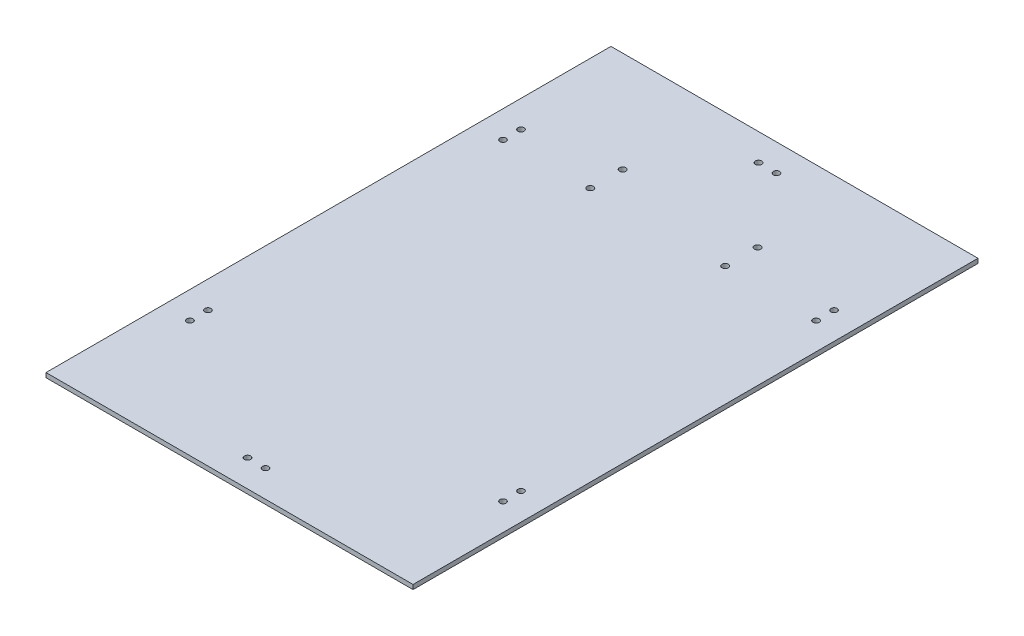
ISO-10303-21;
HEADER;
FILE_DESCRIPTION(('STEP AP214'),'2;1');
FILE_NAME('part.step','',(''),(''),'','','');
FILE_SCHEMA(('AUTOMOTIVE_DESIGN { 1 0 10303 214 1 1 1 1 }'));
ENDSEC;
DATA;
#1=APPLICATION_CONTEXT('core data for automotive mechanical design processes');
#2=APPLICATION_PROTOCOL_DEFINITION('international standard','automotive_design',2000,#1);
#3=PRODUCT_CONTEXT('',#1,'mechanical');
#4=PRODUCT('Part','Part','',(#3));
#5=PRODUCT_RELATED_PRODUCT_CATEGORY('part','',(#4));
#6=PRODUCT_DEFINITION_FORMATION('','',#4);
#7=PRODUCT_DEFINITION_CONTEXT('part definition',#1,'design');
#8=PRODUCT_DEFINITION('design','',#6,#7);
#9=PRODUCT_DEFINITION_SHAPE('','',#8);
#10=(LENGTH_UNIT() NAMED_UNIT(*) SI_UNIT(.MILLI.,.METRE.));
#11=(NAMED_UNIT(*) PLANE_ANGLE_UNIT() SI_UNIT($,.RADIAN.));
#12=(NAMED_UNIT(*) SI_UNIT($,.STERADIAN.) SOLID_ANGLE_UNIT());
#13=UNCERTAINTY_MEASURE_WITH_UNIT(LENGTH_MEASURE(1.E-05),#10,'distance_accuracy_value','');
#14=(GEOMETRIC_REPRESENTATION_CONTEXT(3) GLOBAL_UNCERTAINTY_ASSIGNED_CONTEXT((#13)) GLOBAL_UNIT_ASSIGNED_CONTEXT((#10,
#11,#12)) REPRESENTATION_CONTEXT('',''));
#15=CARTESIAN_POINT('',(0.,0.,0.));
#16=DIRECTION('',(0.,0.,1.));
#17=DIRECTION('',(1.,0.,0.));
#18=AXIS2_PLACEMENT_3D('',#15,#16,#17);
#19=CARTESIAN_POINT('',(0.,3.175,0.));
#20=DIRECTION('',(0.,1.,0.));
#21=DIRECTION('',(0.,0.,1.));
#22=AXIS2_PLACEMENT_3D('',#19,#20,#21);
#23=PLANE('',#22);
#24=CARTESIAN_POINT('',(86.0246300660689,3.175,-148.284323397593));
#25=DIRECTION('',(0.,-1.,0.));
#26=DIRECTION('',(0.,0.,-1.));
#27=AXIS2_PLACEMENT_3D('',#24,#25,#26);
#28=CIRCLE('',#27,2.182876);
#29=CARTESIAN_POINT('',(86.0246300660689,3.175,-150.467199397593));
#30=VERTEX_POINT('',#29);
#31=EDGE_CURVE('E374',#30,#30,#28,.T.);
#32=ORIENTED_EDGE('',*,*,#31,.T.);
#33=EDGE_LOOP('',(#32));
#34=FACE_BOUND('',#33,.T.);
#35=CARTESIAN_POINT('',(-30.8153699339311,3.175,-211.784323397593));
#36=DIRECTION('',(0.,-1.,0.));
#37=DIRECTION('',(0.,0.,-1.));
#38=AXIS2_PLACEMENT_3D('',#35,#36,#37);
#39=CIRCLE('',#38,2.182876);
#40=CARTESIAN_POINT('',(-30.8153699339311,3.175,-213.967199397593));
#41=VERTEX_POINT('',#40);
#42=EDGE_CURVE('E384',#41,#41,#39,.T.);
#43=ORIENTED_EDGE('',*,*,#42,.T.);
#44=EDGE_LOOP('',(#43));
#45=FACE_BOUND('',#44,.T.);
#46=CARTESIAN_POINT('',(-134.955369933931,3.175,-148.284323397593));
#47=DIRECTION('',(0.,-1.,0.));
#48=DIRECTION('',(0.,0.,-1.));
#49=AXIS2_PLACEMENT_3D('',#46,#47,#48);
#50=CIRCLE('',#49,2.182876);
#51=CARTESIAN_POINT('',(-134.955369933931,3.175,-150.467199397593));
#52=VERTEX_POINT('',#51);
#53=EDGE_CURVE('E390',#52,#52,#50,.T.);
#54=ORIENTED_EDGE('',*,*,#53,.T.);
#55=EDGE_LOOP('',(#54));
#56=FACE_BOUND('',#55,.T.);
#57=CARTESIAN_POINT('',(-134.955369933931,3.175,85.3956766024068));
#58=DIRECTION('',(0.,-1.,0.));
#59=DIRECTION('',(0.,0.,-1.));
#60=AXIS2_PLACEMENT_3D('',#57,#58,#59);
#61=CIRCLE('',#60,2.182876);
#62=CARTESIAN_POINT('',(-134.955369933931,3.175,83.2128006024068));
#63=VERTEX_POINT('',#62);
#64=EDGE_CURVE('E396',#63,#63,#61,.T.);
#65=ORIENTED_EDGE('',*,*,#64,.T.);
#66=EDGE_LOOP('',(#65));
#67=FACE_BOUND('',#66,.T.);
#68=CARTESIAN_POINT('',(-18.1153699339311,3.175,-211.784323397593));
#69=DIRECTION('',(0.,-1.,0.));
#70=DIRECTION('',(0.,0.,-1.));
#71=AXIS2_PLACEMENT_3D('',#68,#69,#70);
#72=CIRCLE('',#71,2.182876);
#73=CARTESIAN_POINT('',(-18.1153699339311,3.175,-213.967199397593));
#74=VERTEX_POINT('',#73);
#75=EDGE_CURVE('E402',#74,#74,#72,.T.);
#76=ORIENTED_EDGE('',*,*,#75,.T.);
#77=EDGE_LOOP('',(#76));
#78=FACE_BOUND('',#77,.T.);
#79=CARTESIAN_POINT('',(86.0246300660689,3.175,85.3956766024068));
#80=DIRECTION('',(0.,-1.,0.));
#81=DIRECTION('',(0.,0.,-1.));
#82=AXIS2_PLACEMENT_3D('',#79,#80,#81);
#83=CIRCLE('',#82,2.182876);
#84=CARTESIAN_POINT('',(86.0246300660689,3.175,83.2128006024068));
#85=VERTEX_POINT('',#84);
#86=EDGE_CURVE('E408',#85,#85,#83,.T.);
#87=ORIENTED_EDGE('',*,*,#86,.T.);
#88=EDGE_LOOP('',(#87));
#89=FACE_BOUND('',#88,.T.);
#90=DIRECTION('',(0.,0.,1.));
#91=VECTOR('',#90,1.);
#92=CARTESIAN_POINT('',(105.074630066069,3.175,0.));
#93=LINE('',#92,#91);
#94=CARTESIAN_POINT('',(105.074630066069,3.175,-230.834323397593));
#95=VERTEX_POINT('',#94);
#96=CARTESIAN_POINT('',(105.074630066069,3.175,167.945676602407));
#97=VERTEX_POINT('',#96);
#98=EDGE_CURVE('E97',#95,#97,#93,.T.);
#99=ORIENTED_EDGE('',*,*,#98,.F.);
#100=DIRECTION('',(1.,0.,0.));
#101=VECTOR('',#100,1.);
#102=CARTESIAN_POINT('',(0.,3.175,-230.834323397593));
#103=LINE('',#102,#101);
#104=CARTESIAN_POINT('',(-154.005369933931,3.175,-230.834323397593));
#105=VERTEX_POINT('',#104);
#106=EDGE_CURVE('E89',#105,#95,#103,.T.);
#107=ORIENTED_EDGE('',*,*,#106,.F.);
#108=DIRECTION('',(0.,0.,1.));
#109=VECTOR('',#108,1.);
#110=CARTESIAN_POINT('',(-154.005369933931,3.175,0.));
#111=LINE('',#110,#109);
#112=CARTESIAN_POINT('',(-154.005369933931,3.175,167.945676602407));
#113=VERTEX_POINT('',#112);
#114=EDGE_CURVE('E93',#105,#113,#111,.T.);
#115=ORIENTED_EDGE('',*,*,#114,.T.);
#116=DIRECTION('',(1.,0.,0.));
#117=VECTOR('',#116,1.);
#118=CARTESIAN_POINT('',(0.,3.175,167.945676602407));
#119=LINE('',#118,#117);
#120=EDGE_CURVE('E56',#113,#97,#119,.T.);
#121=ORIENTED_EDGE('',*,*,#120,.T.);
#122=EDGE_LOOP('',(#99,#107,#115,#121));
#123=FACE_BOUND('',#122,.T.);
#124=CARTESIAN_POINT('',(-74.6303699339311,3.175,-159.714323397593));
#125=DIRECTION('',(0.,-1.,0.));
#126=DIRECTION('',(0.,0.,-1.));
#127=AXIS2_PLACEMENT_3D('',#124,#125,#126);
#128=CIRCLE('',#127,2.2479);
#129=CARTESIAN_POINT('',(-74.6303699339311,3.175,-161.962223397593));
#130=VERTEX_POINT('',#129);
#131=EDGE_CURVE('E107',#130,#130,#128,.T.);
#132=ORIENTED_EDGE('',*,*,#131,.T.);
#133=EDGE_LOOP('',(#132));
#134=FACE_BOUND('',#133,.T.);
#135=CARTESIAN_POINT('',(-74.6303699339311,3.175,-136.854323397593));
#136=DIRECTION('',(0.,-1.,0.));
#137=DIRECTION('',(0.,0.,-1.));
#138=AXIS2_PLACEMENT_3D('',#135,#136,#137);
#139=CIRCLE('',#138,2.2479);
#140=CARTESIAN_POINT('',(-74.6303699339311,3.175,-139.102223397593));
#141=VERTEX_POINT('',#140);
#142=EDGE_CURVE('E462',#141,#141,#139,.T.);
#143=ORIENTED_EDGE('',*,*,#142,.T.);
#144=EDGE_LOOP('',(#143));
#145=FACE_BOUND('',#144,.T.);
#146=CARTESIAN_POINT('',(20.6196300660689,3.175,-136.854323397593));
#147=DIRECTION('',(0.,-1.,0.));
#148=DIRECTION('',(0.,0.,-1.));
#149=AXIS2_PLACEMENT_3D('',#146,#147,#148);
#150=CIRCLE('',#149,2.2479);
#151=CARTESIAN_POINT('',(20.6196300660689,3.175,-139.102223397593));
#152=VERTEX_POINT('',#151);
#153=EDGE_CURVE('E456',#152,#152,#150,.T.);
#154=ORIENTED_EDGE('',*,*,#153,.T.);
#155=EDGE_LOOP('',(#154));
#156=FACE_BOUND('',#155,.T.);
#157=CARTESIAN_POINT('',(20.6196300660689,3.175,-159.714323397593));
#158=DIRECTION('',(0.,-1.,0.));
#159=DIRECTION('',(0.,0.,-1.));
#160=AXIS2_PLACEMENT_3D('',#157,#158,#159);
#161=CIRCLE('',#160,2.2479);
#162=CARTESIAN_POINT('',(20.6196300660689,3.175,-161.962223397593));
#163=VERTEX_POINT('',#162);
#164=EDGE_CURVE('E450',#163,#163,#161,.T.);
#165=ORIENTED_EDGE('',*,*,#164,.T.);
#166=EDGE_LOOP('',(#165));
#167=FACE_BOUND('',#166,.T.);
#168=CARTESIAN_POINT('',(-30.8153699339311,3.175,148.895676602407));
#169=DIRECTION('',(0.,-1.,0.));
#170=DIRECTION('',(0.,0.,-1.));
#171=AXIS2_PLACEMENT_3D('',#168,#169,#170);
#172=CIRCLE('',#171,2.182876);
#173=CARTESIAN_POINT('',(-30.8153699339311,3.175,146.712800602407));
#174=VERTEX_POINT('',#173);
#175=EDGE_CURVE('E444',#174,#174,#172,.T.);
#176=ORIENTED_EDGE('',*,*,#175,.T.);
#177=EDGE_LOOP('',(#176));
#178=FACE_BOUND('',#177,.T.);
#179=CARTESIAN_POINT('',(-18.1153699339311,3.175,148.895676602407));
#180=DIRECTION('',(0.,-1.,0.));
#181=DIRECTION('',(0.,0.,-1.));
#182=AXIS2_PLACEMENT_3D('',#179,#180,#181);
#183=CIRCLE('',#182,2.182876);
#184=CARTESIAN_POINT('',(-18.1153699339311,3.175,146.712800602407));
#185=VERTEX_POINT('',#184);
#186=EDGE_CURVE('E438',#185,#185,#183,.T.);
#187=ORIENTED_EDGE('',*,*,#186,.T.);
#188=EDGE_LOOP('',(#187));
#189=FACE_BOUND('',#188,.T.);
#190=CARTESIAN_POINT('',(86.0246300660689,3.175,72.6956766024068));
#191=DIRECTION('',(0.,-1.,0.));
#192=DIRECTION('',(0.,0.,-1.));
#193=AXIS2_PLACEMENT_3D('',#190,#191,#192);
#194=CIRCLE('',#193,2.182876);
#195=CARTESIAN_POINT('',(86.0246300660689,3.175,70.5128006024068));
#196=VERTEX_POINT('',#195);
#197=EDGE_CURVE('E432',#196,#196,#194,.T.);
#198=ORIENTED_EDGE('',*,*,#197,.T.);
#199=EDGE_LOOP('',(#198));
#200=FACE_BOUND('',#199,.T.);
#201=CARTESIAN_POINT('',(86.0246300660689,3.175,-135.584323397593));
#202=DIRECTION('',(0.,-1.,0.));
#203=DIRECTION('',(0.,0.,-1.));
#204=AXIS2_PLACEMENT_3D('',#201,#202,#203);
#205=CIRCLE('',#204,2.182876);
#206=CARTESIAN_POINT('',(86.0246300660689,3.175,-137.767199397593));
#207=VERTEX_POINT('',#206);
#208=EDGE_CURVE('E426',#207,#207,#205,.T.);
#209=ORIENTED_EDGE('',*,*,#208,.T.);
#210=EDGE_LOOP('',(#209));
#211=FACE_BOUND('',#210,.T.);
#212=CARTESIAN_POINT('',(-134.955369933931,3.175,-135.584323397593));
#213=DIRECTION('',(0.,-1.,0.));
#214=DIRECTION('',(0.,0.,-1.));
#215=AXIS2_PLACEMENT_3D('',#212,#213,#214);
#216=CIRCLE('',#215,2.182876);
#217=CARTESIAN_POINT('',(-134.955369933931,3.175,-137.767199397593));
#218=VERTEX_POINT('',#217);
#219=EDGE_CURVE('E420',#218,#218,#216,.T.);
#220=ORIENTED_EDGE('',*,*,#219,.T.);
#221=EDGE_LOOP('',(#220));
#222=FACE_BOUND('',#221,.T.);
#223=CARTESIAN_POINT('',(-134.955369933931,3.175,72.6956766024068));
#224=DIRECTION('',(0.,-1.,0.));
#225=DIRECTION('',(0.,0.,-1.));
#226=AXIS2_PLACEMENT_3D('',#223,#224,#225);
#227=CIRCLE('',#226,2.182876);
#228=CARTESIAN_POINT('',(-134.955369933931,3.175,70.5128006024068));
#229=VERTEX_POINT('',#228);
#230=EDGE_CURVE('E414',#229,#229,#227,.T.);
#231=ORIENTED_EDGE('',*,*,#230,.T.);
#232=EDGE_LOOP('',(#231));
#233=FACE_BOUND('',#232,.T.);
#234=ADVANCED_FACE('F39',(#34,#45,#56,#67,#78,#89,#123,#134,#145,#156,#167,#178,#189,#200,#211,
#222,#233),#23,.T.);
#235=CARTESIAN_POINT('',(0.,0.,0.));
#236=DIRECTION('',(0.,1.,0.));
#237=DIRECTION('',(0.,0.,1.));
#238=AXIS2_PLACEMENT_3D('',#235,#236,#237);
#239=PLANE('',#238);
#240=CARTESIAN_POINT('',(86.0246300660689,0.,-148.284323397593));
#241=DIRECTION('',(0.,-1.,0.));
#242=DIRECTION('',(0.,0.,-1.));
#243=AXIS2_PLACEMENT_3D('',#240,#241,#242);
#244=CIRCLE('',#243,2.182876);
#245=CARTESIAN_POINT('',(86.0246300660689,0.,-150.467199397593));
#246=VERTEX_POINT('',#245);
#247=EDGE_CURVE('E377',#246,#246,#244,.T.);
#248=ORIENTED_EDGE('',*,*,#247,.F.);
#249=EDGE_LOOP('',(#248));
#250=FACE_BOUND('',#249,.T.);
#251=CARTESIAN_POINT('',(-30.8153699339311,0.,-211.784323397593));
#252=DIRECTION('',(0.,-1.,0.));
#253=DIRECTION('',(0.,0.,-1.));
#254=AXIS2_PLACEMENT_3D('',#251,#252,#253);
#255=CIRCLE('',#254,2.182876);
#256=CARTESIAN_POINT('',(-30.8153699339311,0.,-213.967199397593));
#257=VERTEX_POINT('',#256);
#258=EDGE_CURVE('E379',#257,#257,#255,.T.);
#259=ORIENTED_EDGE('',*,*,#258,.F.);
#260=EDGE_LOOP('',(#259));
#261=FACE_BOUND('',#260,.T.);
#262=CARTESIAN_POINT('',(-134.955369933931,0.,-148.284323397593));
#263=DIRECTION('',(0.,-1.,0.));
#264=DIRECTION('',(0.,0.,-1.));
#265=AXIS2_PLACEMENT_3D('',#262,#263,#264);
#266=CIRCLE('',#265,2.182876);
#267=CARTESIAN_POINT('',(-134.955369933931,0.,-150.467199397593));
#268=VERTEX_POINT('',#267);
#269=EDGE_CURVE('E387',#268,#268,#266,.T.);
#270=ORIENTED_EDGE('',*,*,#269,.F.);
#271=EDGE_LOOP('',(#270));
#272=FACE_BOUND('',#271,.T.);
#273=CARTESIAN_POINT('',(-134.955369933931,0.,85.3956766024068));
#274=DIRECTION('',(0.,-1.,0.));
#275=DIRECTION('',(0.,0.,-1.));
#276=AXIS2_PLACEMENT_3D('',#273,#274,#275);
#277=CIRCLE('',#276,2.182876);
#278=CARTESIAN_POINT('',(-134.955369933931,0.,83.2128006024068));
#279=VERTEX_POINT('',#278);
#280=EDGE_CURVE('E393',#279,#279,#277,.T.);
#281=ORIENTED_EDGE('',*,*,#280,.F.);
#282=EDGE_LOOP('',(#281));
#283=FACE_BOUND('',#282,.T.);
#284=CARTESIAN_POINT('',(-18.1153699339311,0.,-211.784323397593));
#285=DIRECTION('',(0.,-1.,0.));
#286=DIRECTION('',(0.,0.,-1.));
#287=AXIS2_PLACEMENT_3D('',#284,#285,#286);
#288=CIRCLE('',#287,2.182876);
#289=CARTESIAN_POINT('',(-18.1153699339311,0.,-213.967199397593));
#290=VERTEX_POINT('',#289);
#291=EDGE_CURVE('E399',#290,#290,#288,.T.);
#292=ORIENTED_EDGE('',*,*,#291,.F.);
#293=EDGE_LOOP('',(#292));
#294=FACE_BOUND('',#293,.T.);
#295=CARTESIAN_POINT('',(86.0246300660689,0.,85.3956766024068));
#296=DIRECTION('',(0.,-1.,0.));
#297=DIRECTION('',(0.,0.,-1.));
#298=AXIS2_PLACEMENT_3D('',#295,#296,#297);
#299=CIRCLE('',#298,2.182876);
#300=CARTESIAN_POINT('',(86.0246300660689,0.,83.2128006024068));
#301=VERTEX_POINT('',#300);
#302=EDGE_CURVE('E405',#301,#301,#299,.T.);
#303=ORIENTED_EDGE('',*,*,#302,.F.);
#304=EDGE_LOOP('',(#303));
#305=FACE_BOUND('',#304,.T.);
#306=CARTESIAN_POINT('',(-134.955369933931,0.,72.6956766024068));
#307=DIRECTION('',(0.,-1.,0.));
#308=DIRECTION('',(0.,0.,-1.));
#309=AXIS2_PLACEMENT_3D('',#306,#307,#308);
#310=CIRCLE('',#309,2.182876);
#311=CARTESIAN_POINT('',(-134.955369933931,0.,70.5128006024068));
#312=VERTEX_POINT('',#311);
#313=EDGE_CURVE('E411',#312,#312,#310,.T.);
#314=ORIENTED_EDGE('',*,*,#313,.F.);
#315=EDGE_LOOP('',(#314));
#316=FACE_BOUND('',#315,.T.);
#317=CARTESIAN_POINT('',(-134.955369933931,0.,-135.584323397593));
#318=DIRECTION('',(0.,-1.,0.));
#319=DIRECTION('',(0.,0.,-1.));
#320=AXIS2_PLACEMENT_3D('',#317,#318,#319);
#321=CIRCLE('',#320,2.182876);
#322=CARTESIAN_POINT('',(-134.955369933931,0.,-137.767199397593));
#323=VERTEX_POINT('',#322);
#324=EDGE_CURVE('E417',#323,#323,#321,.T.);
#325=ORIENTED_EDGE('',*,*,#324,.F.);
#326=EDGE_LOOP('',(#325));
#327=FACE_BOUND('',#326,.T.);
#328=CARTESIAN_POINT('',(86.0246300660689,0.,-135.584323397593));
#329=DIRECTION('',(0.,-1.,0.));
#330=DIRECTION('',(0.,0.,-1.));
#331=AXIS2_PLACEMENT_3D('',#328,#329,#330);
#332=CIRCLE('',#331,2.182876);
#333=CARTESIAN_POINT('',(86.0246300660689,0.,-137.767199397593));
#334=VERTEX_POINT('',#333);
#335=EDGE_CURVE('E423',#334,#334,#332,.T.);
#336=ORIENTED_EDGE('',*,*,#335,.F.);
#337=EDGE_LOOP('',(#336));
#338=FACE_BOUND('',#337,.T.);
#339=CARTESIAN_POINT('',(86.0246300660689,0.,72.6956766024068));
#340=DIRECTION('',(0.,-1.,0.));
#341=DIRECTION('',(0.,0.,-1.));
#342=AXIS2_PLACEMENT_3D('',#339,#340,#341);
#343=CIRCLE('',#342,2.182876);
#344=CARTESIAN_POINT('',(86.0246300660689,0.,70.5128006024068));
#345=VERTEX_POINT('',#344);
#346=EDGE_CURVE('E429',#345,#345,#343,.T.);
#347=ORIENTED_EDGE('',*,*,#346,.F.);
#348=EDGE_LOOP('',(#347));
#349=FACE_BOUND('',#348,.T.);
#350=CARTESIAN_POINT('',(-18.1153699339311,0.,148.895676602407));
#351=DIRECTION('',(0.,-1.,0.));
#352=DIRECTION('',(0.,0.,-1.));
#353=AXIS2_PLACEMENT_3D('',#350,#351,#352);
#354=CIRCLE('',#353,2.182876);
#355=CARTESIAN_POINT('',(-18.1153699339311,0.,146.712800602407));
#356=VERTEX_POINT('',#355);
#357=EDGE_CURVE('E435',#356,#356,#354,.T.);
#358=ORIENTED_EDGE('',*,*,#357,.F.);
#359=EDGE_LOOP('',(#358));
#360=FACE_BOUND('',#359,.T.);
#361=CARTESIAN_POINT('',(-30.8153699339311,0.,148.895676602407));
#362=DIRECTION('',(0.,-1.,0.));
#363=DIRECTION('',(0.,0.,-1.));
#364=AXIS2_PLACEMENT_3D('',#361,#362,#363);
#365=CIRCLE('',#364,2.182876);
#366=CARTESIAN_POINT('',(-30.8153699339311,0.,146.712800602407));
#367=VERTEX_POINT('',#366);
#368=EDGE_CURVE('E441',#367,#367,#365,.T.);
#369=ORIENTED_EDGE('',*,*,#368,.F.);
#370=EDGE_LOOP('',(#369));
#371=FACE_BOUND('',#370,.T.);
#372=CARTESIAN_POINT('',(20.6196300660689,0.,-159.714323397593));
#373=DIRECTION('',(0.,-1.,0.));
#374=DIRECTION('',(0.,0.,-1.));
#375=AXIS2_PLACEMENT_3D('',#372,#373,#374);
#376=CIRCLE('',#375,2.24789999999999);
#377=CARTESIAN_POINT('',(20.6196300660689,0.,-161.962223397593));
#378=VERTEX_POINT('',#377);
#379=EDGE_CURVE('E447',#378,#378,#376,.T.);
#380=ORIENTED_EDGE('',*,*,#379,.F.);
#381=EDGE_LOOP('',(#380));
#382=FACE_BOUND('',#381,.T.);
#383=CARTESIAN_POINT('',(-74.6303699339311,0.,-136.854323397593));
#384=DIRECTION('',(0.,-1.,0.));
#385=DIRECTION('',(0.,0.,-1.));
#386=AXIS2_PLACEMENT_3D('',#383,#384,#385);
#387=CIRCLE('',#386,2.24789999999998);
#388=CARTESIAN_POINT('',(-74.6303699339311,0.,-139.102223397593));
#389=VERTEX_POINT('',#388);
#390=EDGE_CURVE('E459',#389,#389,#387,.T.);
#391=ORIENTED_EDGE('',*,*,#390,.F.);
#392=EDGE_LOOP('',(#391));
#393=FACE_BOUND('',#392,.T.);
#394=CARTESIAN_POINT('',(-74.6303699339311,0.,-159.714323397593));
#395=DIRECTION('',(0.,-1.,0.));
#396=DIRECTION('',(0.,0.,-1.));
#397=AXIS2_PLACEMENT_3D('',#394,#395,#396);
#398=CIRCLE('',#397,2.24789999999998);
#399=CARTESIAN_POINT('',(-74.6303699339311,0.,-161.962223397593));
#400=VERTEX_POINT('',#399);
#401=EDGE_CURVE('E465',#400,#400,#398,.T.);
#402=ORIENTED_EDGE('',*,*,#401,.F.);
#403=EDGE_LOOP('',(#402));
#404=FACE_BOUND('',#403,.T.);
#405=DIRECTION('',(0.,0.,1.));
#406=VECTOR('',#405,1.);
#407=CARTESIAN_POINT('',(105.074630066069,0.,0.));
#408=LINE('',#407,#406);
#409=CARTESIAN_POINT('',(105.074630066069,0.,-230.834323397593));
#410=VERTEX_POINT('',#409);
#411=CARTESIAN_POINT('',(105.074630066069,0.,167.945676602407));
#412=VERTEX_POINT('',#411);
#413=EDGE_CURVE('E104',#410,#412,#408,.T.);
#414=ORIENTED_EDGE('',*,*,#413,.T.);
#415=DIRECTION('',(1.,0.,0.));
#416=VECTOR('',#415,1.);
#417=CARTESIAN_POINT('',(0.,0.,167.945676602407));
#418=LINE('',#417,#416);
#419=CARTESIAN_POINT('',(-154.005369933931,0.,167.945676602407));
#420=VERTEX_POINT('',#419);
#421=EDGE_CURVE('E99',#420,#412,#418,.T.);
#422=ORIENTED_EDGE('',*,*,#421,.F.);
#423=DIRECTION('',(0.,0.,1.));
#424=VECTOR('',#423,1.);
#425=CARTESIAN_POINT('',(-154.005369933931,0.,0.));
#426=LINE('',#425,#424);
#427=CARTESIAN_POINT('',(-154.005369933931,0.,-230.834323397593));
#428=VERTEX_POINT('',#427);
#429=EDGE_CURVE('E71',#428,#420,#426,.T.);
#430=ORIENTED_EDGE('',*,*,#429,.F.);
#431=DIRECTION('',(1.,0.,0.));
#432=VECTOR('',#431,1.);
#433=CARTESIAN_POINT('',(0.,0.,-230.834323397593));
#434=LINE('',#433,#432);
#435=EDGE_CURVE('E91',#428,#410,#434,.T.);
#436=ORIENTED_EDGE('',*,*,#435,.T.);
#437=EDGE_LOOP('',(#414,#422,#430,#436));
#438=FACE_BOUND('',#437,.T.);
#439=CARTESIAN_POINT('',(20.6196300660689,0.,-136.854323397593));
#440=DIRECTION('',(0.,-1.,0.));
#441=DIRECTION('',(0.,0.,-1.));
#442=AXIS2_PLACEMENT_3D('',#439,#440,#441);
#443=CIRCLE('',#442,2.24789999999999);
#444=CARTESIAN_POINT('',(20.6196300660689,0.,-139.102223397593));
#445=VERTEX_POINT('',#444);
#446=EDGE_CURVE('E453',#445,#445,#443,.T.);
#447=ORIENTED_EDGE('',*,*,#446,.F.);
#448=EDGE_LOOP('',(#447));
#449=FACE_BOUND('',#448,.T.);
#450=ADVANCED_FACE('F116',(#250,#261,#272,#283,#294,#305,#316,#327,#338,#349,#360,#371,#382,
#393,#404,#438,#449),#239,.F.);
#451=CARTESIAN_POINT('',(105.074630066069,3.175,0.));
#452=DIRECTION('',(1.,0.,0.));
#453=DIRECTION('',(0.,0.,-1.));
#454=AXIS2_PLACEMENT_3D('',#451,#452,#453);
#455=PLANE('',#454);
#456=ORIENTED_EDGE('',*,*,#413,.F.);
#457=DIRECTION('',(0.,-1.,0.));
#458=VECTOR('',#457,1.);
#459=CARTESIAN_POINT('',(105.074630066069,3.175,-230.834323397593));
#460=LINE('',#459,#458);
#461=EDGE_CURVE('E11',#95,#410,#460,.T.);
#462=ORIENTED_EDGE('',*,*,#461,.F.);
#463=ORIENTED_EDGE('',*,*,#98,.T.);
#464=DIRECTION('',(0.,-1.,0.));
#465=VECTOR('',#464,1.);
#466=CARTESIAN_POINT('',(105.074630066069,3.175,167.945676602407));
#467=LINE('',#466,#465);
#468=EDGE_CURVE('E78',#97,#412,#467,.T.);
#469=ORIENTED_EDGE('',*,*,#468,.T.);
#470=EDGE_LOOP('',(#456,#462,#463,#469));
#471=FACE_BOUND('',#470,.T.);
#472=ADVANCED_FACE('F41',(#471),#455,.T.);
#473=CARTESIAN_POINT('',(0.,3.175,-230.834323397593));
#474=DIRECTION('',(0.,0.,-1.));
#475=DIRECTION('',(-1.,0.,0.));
#476=AXIS2_PLACEMENT_3D('',#473,#474,#475);
#477=PLANE('',#476);
#478=ORIENTED_EDGE('',*,*,#435,.F.);
#479=DIRECTION('',(0.,-1.,0.));
#480=VECTOR('',#479,1.);
#481=CARTESIAN_POINT('',(-154.005369933931,3.175,-230.834323397593));
#482=LINE('',#481,#480);
#483=EDGE_CURVE('E48',#105,#428,#482,.T.);
#484=ORIENTED_EDGE('',*,*,#483,.F.);
#485=ORIENTED_EDGE('',*,*,#106,.T.);
#486=ORIENTED_EDGE('',*,*,#461,.T.);
#487=EDGE_LOOP('',(#478,#484,#485,#486));
#488=FACE_BOUND('',#487,.T.);
#489=ADVANCED_FACE('F87',(#488),#477,.T.);
#490=CARTESIAN_POINT('',(-154.005369933931,3.175,0.));
#491=DIRECTION('',(1.,0.,0.));
#492=DIRECTION('',(0.,0.,-1.));
#493=AXIS2_PLACEMENT_3D('',#490,#491,#492);
#494=PLANE('',#493);
#495=ORIENTED_EDGE('',*,*,#429,.T.);
#496=DIRECTION('',(0.,-1.,0.));
#497=VECTOR('',#496,1.);
#498=CARTESIAN_POINT('',(-154.005369933931,3.175,167.945676602407));
#499=LINE('',#498,#497);
#500=EDGE_CURVE('E92',#113,#420,#499,.T.);
#501=ORIENTED_EDGE('',*,*,#500,.F.);
#502=ORIENTED_EDGE('',*,*,#114,.F.);
#503=ORIENTED_EDGE('',*,*,#483,.T.);
#504=EDGE_LOOP('',(#495,#501,#502,#503));
#505=FACE_BOUND('',#504,.T.);
#506=ADVANCED_FACE('F94',(#505),#494,.F.);
#507=CARTESIAN_POINT('',(0.,3.175,167.945676602407));
#508=DIRECTION('',(0.,0.,-1.));
#509=DIRECTION('',(-1.,0.,0.));
#510=AXIS2_PLACEMENT_3D('',#507,#508,#509);
#511=PLANE('',#510);
#512=ORIENTED_EDGE('',*,*,#421,.T.);
#513=ORIENTED_EDGE('',*,*,#468,.F.);
#514=ORIENTED_EDGE('',*,*,#120,.F.);
#515=ORIENTED_EDGE('',*,*,#500,.T.);
#516=EDGE_LOOP('',(#512,#513,#514,#515));
#517=FACE_BOUND('',#516,.T.);
#518=ADVANCED_FACE('F114',(#517),#511,.F.);
#519=CARTESIAN_POINT('',(-74.6303699339311,0.,-159.714323397593));
#520=DIRECTION('',(0.,-1.,0.));
#521=DIRECTION('',(0.,0.,-1.));
#522=AXIS2_PLACEMENT_3D('',#519,#520,#521);
#523=CYLINDRICAL_SURFACE('',#522,2.24789999999999);
#524=ORIENTED_EDGE('',*,*,#131,.F.);
#525=EDGE_LOOP('',(#524));
#526=FACE_BOUND('',#525,.T.);
#527=ORIENTED_EDGE('',*,*,#401,.T.);
#528=EDGE_LOOP('',(#527));
#529=FACE_BOUND('',#528,.T.);
#530=ADVANCED_FACE('F133',(#526,#529),#523,.F.);
#531=CARTESIAN_POINT('',(-74.6303699339311,0.,-136.854323397593));
#532=DIRECTION('',(0.,-1.,0.));
#533=DIRECTION('',(0.,0.,-1.));
#534=AXIS2_PLACEMENT_3D('',#531,#532,#533);
#535=CYLINDRICAL_SURFACE('',#534,2.24789999999999);
#536=ORIENTED_EDGE('',*,*,#142,.F.);
#537=EDGE_LOOP('',(#536));
#538=FACE_BOUND('',#537,.T.);
#539=ORIENTED_EDGE('',*,*,#390,.T.);
#540=EDGE_LOOP('',(#539));
#541=FACE_BOUND('',#540,.T.);
#542=ADVANCED_FACE('F153',(#538,#541),#535,.F.);
#543=CARTESIAN_POINT('',(20.6196300660689,0.,-136.854323397593));
#544=DIRECTION('',(0.,-1.,0.));
#545=DIRECTION('',(0.,0.,-1.));
#546=AXIS2_PLACEMENT_3D('',#543,#544,#545);
#547=CYLINDRICAL_SURFACE('',#546,2.24789999999999);
#548=ORIENTED_EDGE('',*,*,#153,.F.);
#549=EDGE_LOOP('',(#548));
#550=FACE_BOUND('',#549,.T.);
#551=ORIENTED_EDGE('',*,*,#446,.T.);
#552=EDGE_LOOP('',(#551));
#553=FACE_BOUND('',#552,.T.);
#554=ADVANCED_FACE('F160',(#550,#553),#547,.F.);
#555=CARTESIAN_POINT('',(20.6196300660689,0.,-159.714323397593));
#556=DIRECTION('',(0.,-1.,0.));
#557=DIRECTION('',(0.,0.,-1.));
#558=AXIS2_PLACEMENT_3D('',#555,#556,#557);
#559=CYLINDRICAL_SURFACE('',#558,2.24789999999999);
#560=ORIENTED_EDGE('',*,*,#164,.F.);
#561=EDGE_LOOP('',(#560));
#562=FACE_BOUND('',#561,.T.);
#563=ORIENTED_EDGE('',*,*,#379,.T.);
#564=EDGE_LOOP('',(#563));
#565=FACE_BOUND('',#564,.T.);
#566=ADVANCED_FACE('F167',(#562,#565),#559,.F.);
#567=CARTESIAN_POINT('',(-30.8153699339311,0.,148.895676602407));
#568=DIRECTION('',(0.,-1.,0.));
#569=DIRECTION('',(0.,0.,-1.));
#570=AXIS2_PLACEMENT_3D('',#567,#568,#569);
#571=CYLINDRICAL_SURFACE('',#570,2.182876);
#572=ORIENTED_EDGE('',*,*,#175,.F.);
#573=EDGE_LOOP('',(#572));
#574=FACE_BOUND('',#573,.T.);
#575=ORIENTED_EDGE('',*,*,#368,.T.);
#576=EDGE_LOOP('',(#575));
#577=FACE_BOUND('',#576,.T.);
#578=ADVANCED_FACE('F175',(#574,#577),#571,.F.);
#579=CARTESIAN_POINT('',(-18.1153699339311,0.,148.895676602407));
#580=DIRECTION('',(0.,-1.,0.));
#581=DIRECTION('',(0.,0.,-1.));
#582=AXIS2_PLACEMENT_3D('',#579,#580,#581);
#583=CYLINDRICAL_SURFACE('',#582,2.182876);
#584=ORIENTED_EDGE('',*,*,#186,.F.);
#585=EDGE_LOOP('',(#584));
#586=FACE_BOUND('',#585,.T.);
#587=ORIENTED_EDGE('',*,*,#357,.T.);
#588=EDGE_LOOP('',(#587));
#589=FACE_BOUND('',#588,.T.);
#590=ADVANCED_FACE('F183',(#586,#589),#583,.F.);
#591=CARTESIAN_POINT('',(86.0246300660689,0.,72.6956766024068));
#592=DIRECTION('',(0.,-1.,0.));
#593=DIRECTION('',(0.,0.,-1.));
#594=AXIS2_PLACEMENT_3D('',#591,#592,#593);
#595=CYLINDRICAL_SURFACE('',#594,2.182876);
#596=ORIENTED_EDGE('',*,*,#197,.F.);
#597=EDGE_LOOP('',(#596));
#598=FACE_BOUND('',#597,.T.);
#599=ORIENTED_EDGE('',*,*,#346,.T.);
#600=EDGE_LOOP('',(#599));
#601=FACE_BOUND('',#600,.T.);
#602=ADVANCED_FACE('F192',(#598,#601),#595,.F.);
#603=CARTESIAN_POINT('',(86.0246300660689,0.,-135.584323397593));
#604=DIRECTION('',(0.,-1.,0.));
#605=DIRECTION('',(0.,0.,-1.));
#606=AXIS2_PLACEMENT_3D('',#603,#604,#605);
#607=CYLINDRICAL_SURFACE('',#606,2.182876);
#608=ORIENTED_EDGE('',*,*,#208,.F.);
#609=EDGE_LOOP('',(#608));
#610=FACE_BOUND('',#609,.T.);
#611=ORIENTED_EDGE('',*,*,#335,.T.);
#612=EDGE_LOOP('',(#611));
#613=FACE_BOUND('',#612,.T.);
#614=ADVANCED_FACE('F200',(#610,#613),#607,.F.);
#615=CARTESIAN_POINT('',(-134.955369933931,0.,-135.584323397593));
#616=DIRECTION('',(0.,-1.,0.));
#617=DIRECTION('',(0.,0.,-1.));
#618=AXIS2_PLACEMENT_3D('',#615,#616,#617);
#619=CYLINDRICAL_SURFACE('',#618,2.182876);
#620=ORIENTED_EDGE('',*,*,#219,.F.);
#621=EDGE_LOOP('',(#620));
#622=FACE_BOUND('',#621,.T.);
#623=ORIENTED_EDGE('',*,*,#324,.T.);
#624=EDGE_LOOP('',(#623));
#625=FACE_BOUND('',#624,.T.);
#626=ADVANCED_FACE('F208',(#622,#625),#619,.F.);
#627=CARTESIAN_POINT('',(-134.955369933931,0.,72.6956766024068));
#628=DIRECTION('',(0.,-1.,0.));
#629=DIRECTION('',(0.,0.,-1.));
#630=AXIS2_PLACEMENT_3D('',#627,#628,#629);
#631=CYLINDRICAL_SURFACE('',#630,2.182876);
#632=ORIENTED_EDGE('',*,*,#230,.F.);
#633=EDGE_LOOP('',(#632));
#634=FACE_BOUND('',#633,.T.);
#635=ORIENTED_EDGE('',*,*,#313,.T.);
#636=EDGE_LOOP('',(#635));
#637=FACE_BOUND('',#636,.T.);
#638=ADVANCED_FACE('F216',(#634,#637),#631,.F.);
#639=CARTESIAN_POINT('',(86.0246300660689,0.,85.3956766024068));
#640=DIRECTION('',(0.,-1.,0.));
#641=DIRECTION('',(0.,0.,-1.));
#642=AXIS2_PLACEMENT_3D('',#639,#640,#641);
#643=CYLINDRICAL_SURFACE('',#642,2.182876);
#644=ORIENTED_EDGE('',*,*,#86,.F.);
#645=EDGE_LOOP('',(#644));
#646=FACE_BOUND('',#645,.T.);
#647=ORIENTED_EDGE('',*,*,#302,.T.);
#648=EDGE_LOOP('',(#647));
#649=FACE_BOUND('',#648,.T.);
#650=ADVANCED_FACE('F224',(#646,#649),#643,.F.);
#651=CARTESIAN_POINT('',(-18.1153699339311,0.,-211.784323397593));
#652=DIRECTION('',(0.,-1.,0.));
#653=DIRECTION('',(0.,0.,-1.));
#654=AXIS2_PLACEMENT_3D('',#651,#652,#653);
#655=CYLINDRICAL_SURFACE('',#654,2.182876);
#656=ORIENTED_EDGE('',*,*,#75,.F.);
#657=EDGE_LOOP('',(#656));
#658=FACE_BOUND('',#657,.T.);
#659=ORIENTED_EDGE('',*,*,#291,.T.);
#660=EDGE_LOOP('',(#659));
#661=FACE_BOUND('',#660,.T.);
#662=ADVANCED_FACE('F232',(#658,#661),#655,.F.);
#663=CARTESIAN_POINT('',(-134.955369933931,0.,85.3956766024068));
#664=DIRECTION('',(0.,-1.,0.));
#665=DIRECTION('',(0.,0.,-1.));
#666=AXIS2_PLACEMENT_3D('',#663,#664,#665);
#667=CYLINDRICAL_SURFACE('',#666,2.182876);
#668=ORIENTED_EDGE('',*,*,#64,.F.);
#669=EDGE_LOOP('',(#668));
#670=FACE_BOUND('',#669,.T.);
#671=ORIENTED_EDGE('',*,*,#280,.T.);
#672=EDGE_LOOP('',(#671));
#673=FACE_BOUND('',#672,.T.);
#674=ADVANCED_FACE('F240',(#670,#673),#667,.F.);
#675=CARTESIAN_POINT('',(-134.955369933931,0.,-148.284323397593));
#676=DIRECTION('',(0.,-1.,0.));
#677=DIRECTION('',(0.,0.,-1.));
#678=AXIS2_PLACEMENT_3D('',#675,#676,#677);
#679=CYLINDRICAL_SURFACE('',#678,2.182876);
#680=ORIENTED_EDGE('',*,*,#53,.F.);
#681=EDGE_LOOP('',(#680));
#682=FACE_BOUND('',#681,.T.);
#683=ORIENTED_EDGE('',*,*,#269,.T.);
#684=EDGE_LOOP('',(#683));
#685=FACE_BOUND('',#684,.T.);
#686=ADVANCED_FACE('F248',(#682,#685),#679,.F.);
#687=CARTESIAN_POINT('',(-30.8153699339311,0.,-211.784323397593));
#688=DIRECTION('',(0.,-1.,0.));
#689=DIRECTION('',(0.,0.,-1.));
#690=AXIS2_PLACEMENT_3D('',#687,#688,#689);
#691=CYLINDRICAL_SURFACE('',#690,2.182876);
#692=ORIENTED_EDGE('',*,*,#42,.F.);
#693=EDGE_LOOP('',(#692));
#694=FACE_BOUND('',#693,.T.);
#695=ORIENTED_EDGE('',*,*,#258,.T.);
#696=EDGE_LOOP('',(#695));
#697=FACE_BOUND('',#696,.T.);
#698=ADVANCED_FACE('F256',(#694,#697),#691,.F.);
#699=CARTESIAN_POINT('',(86.0246300660689,0.,-148.284323397593));
#700=DIRECTION('',(0.,-1.,0.));
#701=DIRECTION('',(0.,0.,-1.));
#702=AXIS2_PLACEMENT_3D('',#699,#700,#701);
#703=CYLINDRICAL_SURFACE('',#702,2.182876);
#704=ORIENTED_EDGE('',*,*,#31,.F.);
#705=EDGE_LOOP('',(#704));
#706=FACE_BOUND('',#705,.T.);
#707=ORIENTED_EDGE('',*,*,#247,.T.);
#708=EDGE_LOOP('',(#707));
#709=FACE_BOUND('',#708,.T.);
#710=ADVANCED_FACE('F264',(#706,#709),#703,.F.);
#711=CLOSED_SHELL('',(#234,#450,#472,#489,#506,#518,#530,#542,#554,#566,#578,#590,#602,#614,
#626,#638,#650,#662,#674,#686,#698,#710));
#712=MANIFOLD_SOLID_BREP('B2',#711);
#713=ADVANCED_BREP_SHAPE_REPRESENTATION('',(#18,#712),#14);
#714=SHAPE_DEFINITION_REPRESENTATION(#9,#713);
ENDSEC;
END-ISO-10303-21;
